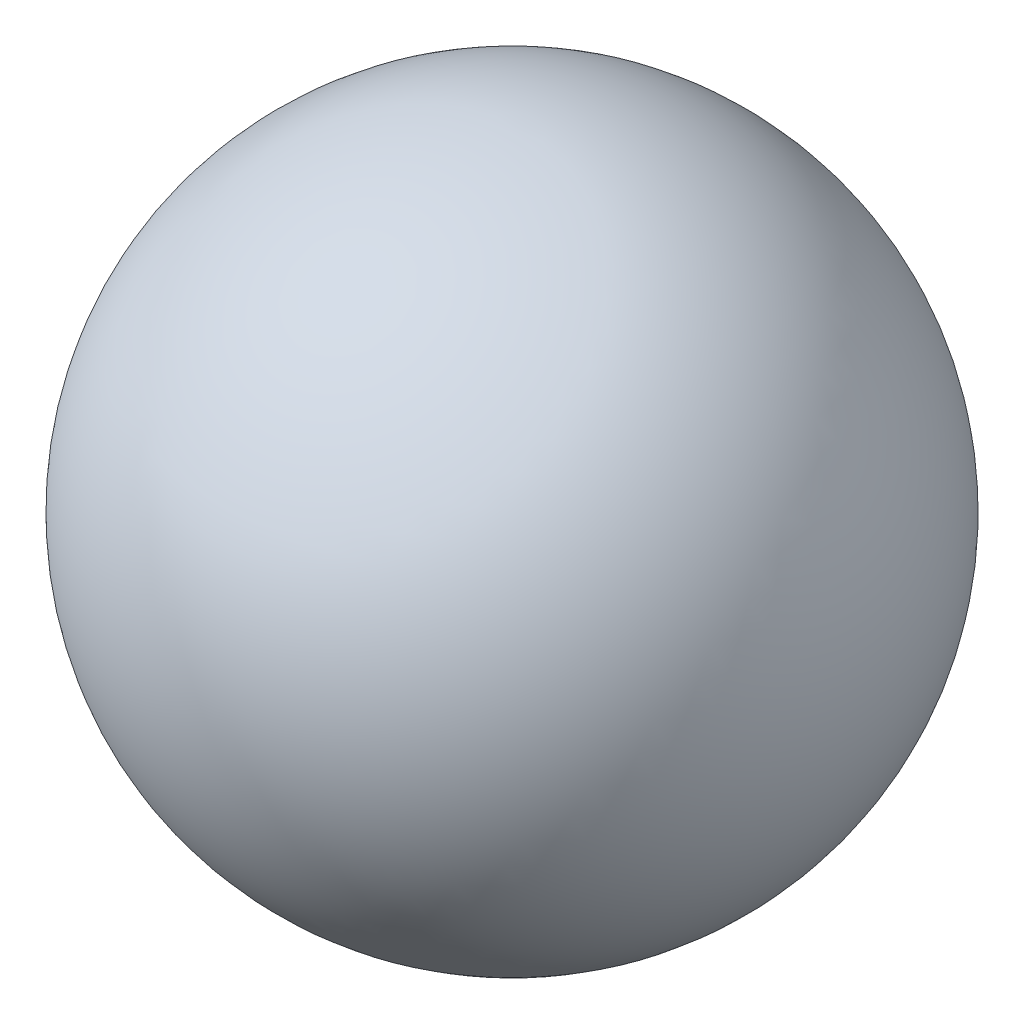
ISO-10303-21;
HEADER;
FILE_DESCRIPTION(('STEP AP214'),'2;1');
FILE_NAME('part.step','',(''),(''),'','','');
FILE_SCHEMA(('AUTOMOTIVE_DESIGN { 1 0 10303 214 1 1 1 1 }'));
ENDSEC;
DATA;
#1=APPLICATION_CONTEXT('core data for automotive mechanical design processes');
#2=APPLICATION_PROTOCOL_DEFINITION('international standard','automotive_design',2000,#1);
#3=PRODUCT_CONTEXT('',#1,'mechanical');
#4=PRODUCT('Part','Part','',(#3));
#5=PRODUCT_RELATED_PRODUCT_CATEGORY('part','',(#4));
#6=PRODUCT_DEFINITION_FORMATION('','',#4);
#7=PRODUCT_DEFINITION_CONTEXT('part definition',#1,'design');
#8=PRODUCT_DEFINITION('design','',#6,#7);
#9=PRODUCT_DEFINITION_SHAPE('','',#8);
#10=(LENGTH_UNIT() NAMED_UNIT(*) SI_UNIT(.MILLI.,.METRE.));
#11=(NAMED_UNIT(*) PLANE_ANGLE_UNIT() SI_UNIT($,.RADIAN.));
#12=(NAMED_UNIT(*) SI_UNIT($,.STERADIAN.) SOLID_ANGLE_UNIT());
#13=UNCERTAINTY_MEASURE_WITH_UNIT(LENGTH_MEASURE(1.E-05),#10,'distance_accuracy_value','');
#14=(GEOMETRIC_REPRESENTATION_CONTEXT(3) GLOBAL_UNCERTAINTY_ASSIGNED_CONTEXT((#13)) GLOBAL_UNIT_ASSIGNED_CONTEXT((#10,
#11,#12)) REPRESENTATION_CONTEXT('',''));
#15=CARTESIAN_POINT('',(0.,0.,0.));
#16=DIRECTION('',(0.,0.,1.));
#17=DIRECTION('',(1.,0.,0.));
#18=AXIS2_PLACEMENT_3D('',#15,#16,#17);
#19=CARTESIAN_POINT('',(0.,0.,0.));
#20=DIRECTION('',(0.,1.,0.));
#21=DIRECTION('',(1.,0.,0.));
#22=AXIS2_PLACEMENT_3D('',#19,#20,#21);
#23=SPHERICAL_SURFACE('',#22,20.);
#24=CARTESIAN_POINT('',(0.,-18.,0.));
#25=DIRECTION('',(0.,1.,0.));
#26=DIRECTION('',(0.,0.,1.));
#27=AXIS2_PLACEMENT_3D('',#24,#25,#26);
#28=CIRCLE('',#27,8.71779788708135);
#29=CARTESIAN_POINT('',(0.,-18.,8.71779788708135));
#30=VERTEX_POINT('',#29);
#31=EDGE_CURVE('E11',#30,#30,#28,.T.);
#32=ORIENTED_EDGE('',*,*,#31,.T.);
#33=EDGE_LOOP('',(#32));
#34=FACE_BOUND('',#33,.T.);
#35=ADVANCED_FACE('F43',(#34),#23,.T.);
#36=CARTESIAN_POINT('',(-8.71779788708135,-18.,86.6025403784439));
#37=DIRECTION('',(0.,1.,0.));
#38=DIRECTION('',(0.,0.,1.));
#39=AXIS2_PLACEMENT_3D('',#36,#37,#38);
#40=PLANE('',#39);
#41=CARTESIAN_POINT('',(0.,-18.,0.));
#42=DIRECTION('',(0.,-1.,0.));
#43=DIRECTION('',(0.,0.,-1.));
#44=AXIS2_PLACEMENT_3D('',#41,#42,#43);
#45=CIRCLE('',#44,4.25);
#46=CARTESIAN_POINT('',(0.,-18.,-4.25));
#47=VERTEX_POINT('',#46);
#48=EDGE_CURVE('E63',#47,#47,#45,.T.);
#49=ORIENTED_EDGE('',*,*,#48,.F.);
#50=EDGE_LOOP('',(#49));
#51=FACE_BOUND('',#50,.T.);
#52=ORIENTED_EDGE('',*,*,#31,.F.);
#53=EDGE_LOOP('',(#52));
#54=FACE_BOUND('',#53,.T.);
#55=ADVANCED_FACE('F57',(#51,#54),#40,.F.);
#56=CARTESIAN_POINT('',(0.,-8.,0.));
#57=DIRECTION('',(0.,-1.,0.));
#58=DIRECTION('',(0.,0.,-1.));
#59=AXIS2_PLACEMENT_3D('',#56,#57,#58);
#60=CONICAL_SURFACE('',#59,4.25,1.02974425867665);
#61=CARTESIAN_POINT('',(0.,-5.44634236913287,0.));
#62=VERTEX_POINT('',#61);
#63=VERTEX_LOOP('',#62);
#64=FACE_BOUND('',#63,.T.);
#65=CARTESIAN_POINT('',(0.,-8.,0.));
#66=DIRECTION('',(0.,-1.,0.));
#67=DIRECTION('',(0.,0.,-1.));
#68=AXIS2_PLACEMENT_3D('',#65,#66,#67);
#69=CIRCLE('',#68,4.25);
#70=CARTESIAN_POINT('',(0.,-8.,-4.25));
#71=VERTEX_POINT('',#70);
#72=EDGE_CURVE('E50',#71,#71,#69,.T.);
#73=ORIENTED_EDGE('',*,*,#72,.T.);
#74=EDGE_LOOP('',(#73));
#75=FACE_BOUND('',#74,.T.);
#76=ADVANCED_FACE('F53',(#64,#75),#60,.F.);
#77=CARTESIAN_POINT('',(0.,-18.,0.));
#78=DIRECTION('',(0.,-1.,0.));
#79=DIRECTION('',(0.,0.,-1.));
#80=AXIS2_PLACEMENT_3D('',#77,#78,#79);
#81=CYLINDRICAL_SURFACE('',#80,4.25);
#82=ORIENTED_EDGE('',*,*,#72,.F.);
#83=EDGE_LOOP('',(#82));
#84=FACE_BOUND('',#83,.T.);
#85=ORIENTED_EDGE('',*,*,#48,.T.);
#86=EDGE_LOOP('',(#85));
#87=FACE_BOUND('',#86,.T.);
#88=ADVANCED_FACE('F56',(#84,#87),#81,.F.);
#89=CLOSED_SHELL('',(#35,#55,#76,#88));
#90=MANIFOLD_SOLID_BREP('B2',#89);
#91=ADVANCED_BREP_SHAPE_REPRESENTATION('',(#18,#90),#14);
#92=SHAPE_DEFINITION_REPRESENTATION(#9,#91);
ENDSEC;
END-ISO-10303-21;
